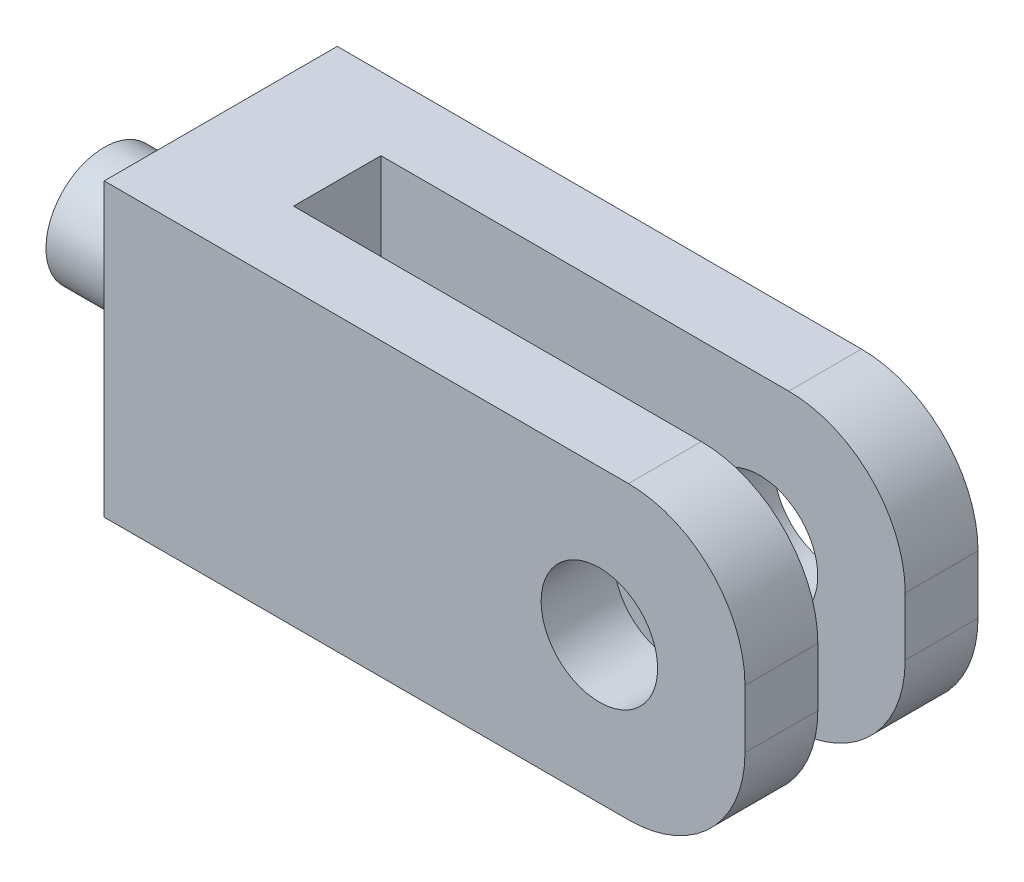
ISO-10303-21;
HEADER;
FILE_DESCRIPTION(('STEP AP214'),'2;1');
FILE_NAME('part.step','',(''),(''),'','','');
FILE_SCHEMA(('AUTOMOTIVE_DESIGN { 1 0 10303 214 1 1 1 1 }'));
ENDSEC;
DATA;
#1=APPLICATION_CONTEXT('core data for automotive mechanical design processes');
#2=APPLICATION_PROTOCOL_DEFINITION('international standard','automotive_design',2000,#1);
#3=PRODUCT_CONTEXT('',#1,'mechanical');
#4=PRODUCT('Part','Part','',(#3));
#5=PRODUCT_RELATED_PRODUCT_CATEGORY('part','',(#4));
#6=PRODUCT_DEFINITION_FORMATION('','',#4);
#7=PRODUCT_DEFINITION_CONTEXT('part definition',#1,'design');
#8=PRODUCT_DEFINITION('design','',#6,#7);
#9=PRODUCT_DEFINITION_SHAPE('','',#8);
#10=(LENGTH_UNIT() NAMED_UNIT(*) SI_UNIT(.MILLI.,.METRE.));
#11=(NAMED_UNIT(*) PLANE_ANGLE_UNIT() SI_UNIT($,.RADIAN.));
#12=(NAMED_UNIT(*) SI_UNIT($,.STERADIAN.) SOLID_ANGLE_UNIT());
#13=UNCERTAINTY_MEASURE_WITH_UNIT(LENGTH_MEASURE(1.E-05),#10,'distance_accuracy_value','');
#14=(GEOMETRIC_REPRESENTATION_CONTEXT(3) GLOBAL_UNCERTAINTY_ASSIGNED_CONTEXT((#13)) GLOBAL_UNIT_ASSIGNED_CONTEXT((#10,
#11,#12)) REPRESENTATION_CONTEXT('',''));
#15=CARTESIAN_POINT('',(0.,0.,0.));
#16=DIRECTION('',(0.,0.,1.));
#17=DIRECTION('',(1.,0.,0.));
#18=AXIS2_PLACEMENT_3D('',#15,#16,#17);
#19=CARTESIAN_POINT('',(55.,25.,40.));
#20=DIRECTION('',(-1.,0.,0.));
#21=DIRECTION('',(0.,0.,1.));
#22=AXIS2_PLACEMENT_3D('',#19,#20,#21);
#23=PLANE('',#22);
#24=DIRECTION('',(0.,1.,0.));
#25=VECTOR('',#24,1.);
#26=CARTESIAN_POINT('',(55.,25.,12.5));
#27=LINE('',#26,#25);
#28=CARTESIAN_POINT('',(55.,-4.99999999999999,12.5));
#29=VERTEX_POINT('',#28);
#30=CARTESIAN_POINT('',(55.,5.00000000000001,12.5));
#31=VERTEX_POINT('',#30);
#32=EDGE_CURVE('E158',#29,#31,#27,.T.);
#33=ORIENTED_EDGE('',*,*,#32,.F.);
#34=DIRECTION('',(0.,0.,-1.));
#35=VECTOR('',#34,1.);
#36=CARTESIAN_POINT('',(55.,-4.99999999999999,40.));
#37=LINE('',#36,#35);
#38=CARTESIAN_POINT('',(55.,-4.99999999999999,0.));
#39=VERTEX_POINT('',#38);
#40=EDGE_CURVE('E214',#29,#39,#37,.T.);
#41=ORIENTED_EDGE('',*,*,#40,.T.);
#42=DIRECTION('',(0.,1.,0.));
#43=VECTOR('',#42,1.);
#44=CARTESIAN_POINT('',(55.,25.,0.));
#45=LINE('',#44,#43);
#46=CARTESIAN_POINT('',(55.,5.00000000000001,0.));
#47=VERTEX_POINT('',#46);
#48=EDGE_CURVE('E165',#39,#47,#45,.T.);
#49=ORIENTED_EDGE('',*,*,#48,.T.);
#50=DIRECTION('',(0.,0.,-1.));
#51=VECTOR('',#50,1.);
#52=CARTESIAN_POINT('',(55.,5.00000000000001,40.));
#53=LINE('',#52,#51);
#54=EDGE_CURVE('E212',#47,#31,#53,.F.);
#55=ORIENTED_EDGE('',*,*,#54,.T.);
#56=EDGE_LOOP('',(#33,#41,#49,#55));
#57=FACE_BOUND('',#56,.T.);
#58=ADVANCED_FACE('F39',(#57),#23,.F.);
#59=DIRECTION('',(0.,1.,0.));
#60=VECTOR('',#59,1.);
#61=CARTESIAN_POINT('',(55.,25.,40.));
#62=LINE('',#61,#60);
#63=CARTESIAN_POINT('',(55.,-4.99999999999999,40.));
#64=VERTEX_POINT('',#63);
#65=CARTESIAN_POINT('',(55.,5.00000000000001,40.));
#66=VERTEX_POINT('',#65);
#67=EDGE_CURVE('E170',#64,#66,#62,.T.);
#68=ORIENTED_EDGE('',*,*,#67,.F.);
#69=DIRECTION('',(0.,0.,-1.));
#70=VECTOR('',#69,1.);
#71=CARTESIAN_POINT('',(55.,-4.99999999999999,40.));
#72=LINE('',#71,#70);
#73=CARTESIAN_POINT('',(55.,-4.99999999999999,27.5));
#74=VERTEX_POINT('',#73);
#75=EDGE_CURVE('E197',#64,#74,#72,.T.);
#76=ORIENTED_EDGE('',*,*,#75,.T.);
#77=DIRECTION('',(0.,-1.,0.));
#78=VECTOR('',#77,1.);
#79=CARTESIAN_POINT('',(55.,25.,27.5));
#80=LINE('',#79,#78);
#81=CARTESIAN_POINT('',(55.,5.00000000000001,27.5));
#82=VERTEX_POINT('',#81);
#83=EDGE_CURVE('E147',#82,#74,#80,.T.);
#84=ORIENTED_EDGE('',*,*,#83,.F.);
#85=DIRECTION('',(0.,0.,-1.));
#86=VECTOR('',#85,1.);
#87=CARTESIAN_POINT('',(55.,5.00000000000001,40.));
#88=LINE('',#87,#86);
#89=EDGE_CURVE('E195',#82,#66,#88,.F.);
#90=ORIENTED_EDGE('',*,*,#89,.T.);
#91=EDGE_LOOP('',(#68,#76,#84,#90));
#92=FACE_BOUND('',#91,.T.);
#93=ADVANCED_FACE('F249',(#92),#23,.F.);
#94=CARTESIAN_POINT('',(-55.,25.,40.));
#95=DIRECTION('',(0.,-1.,0.));
#96=DIRECTION('',(0.,0.,-1.));
#97=AXIS2_PLACEMENT_3D('',#94,#95,#96);
#98=PLANE('',#97);
#99=DIRECTION('',(1.,0.,0.));
#100=VECTOR('',#99,1.);
#101=CARTESIAN_POINT('',(-35.,25.,12.5));
#102=LINE('',#101,#100);
#103=CARTESIAN_POINT('',(-35.,25.,12.5));
#104=VERTEX_POINT('',#103);
#105=CARTESIAN_POINT('',(35.,25.,12.5));
#106=VERTEX_POINT('',#105);
#107=EDGE_CURVE('E129',#104,#106,#102,.T.);
#108=ORIENTED_EDGE('',*,*,#107,.T.);
#109=DIRECTION('',(0.,0.,-1.));
#110=VECTOR('',#109,1.);
#111=CARTESIAN_POINT('',(35.,25.,40.));
#112=LINE('',#111,#110);
#113=CARTESIAN_POINT('',(35.,25.,0.));
#114=VERTEX_POINT('',#113);
#115=EDGE_CURVE('E48',#106,#114,#112,.T.);
#116=ORIENTED_EDGE('',*,*,#115,.T.);
#117=DIRECTION('',(-1.,0.,0.));
#118=VECTOR('',#117,1.);
#119=CARTESIAN_POINT('',(-55.,25.,0.));
#120=LINE('',#119,#118);
#121=CARTESIAN_POINT('',(-55.,25.,0.));
#122=VERTEX_POINT('',#121);
#123=EDGE_CURVE('E184',#114,#122,#120,.T.);
#124=ORIENTED_EDGE('',*,*,#123,.T.);
#125=DIRECTION('',(0.,0.,-1.));
#126=VECTOR('',#125,1.);
#127=CARTESIAN_POINT('',(-55.,25.,40.));
#128=LINE('',#127,#126);
#129=CARTESIAN_POINT('',(-55.,25.,40.));
#130=VERTEX_POINT('',#129);
#131=EDGE_CURVE('E192',#130,#122,#128,.T.);
#132=ORIENTED_EDGE('',*,*,#131,.F.);
#133=DIRECTION('',(-1.,0.,0.));
#134=VECTOR('',#133,1.);
#135=CARTESIAN_POINT('',(-55.,25.,40.));
#136=LINE('',#135,#134);
#137=CARTESIAN_POINT('',(35.,25.,40.));
#138=VERTEX_POINT('',#137);
#139=EDGE_CURVE('E173',#138,#130,#136,.T.);
#140=ORIENTED_EDGE('',*,*,#139,.F.);
#141=DIRECTION('',(0.,0.,-1.));
#142=VECTOR('',#141,1.);
#143=CARTESIAN_POINT('',(35.,25.,40.));
#144=LINE('',#143,#142);
#145=CARTESIAN_POINT('',(35.,25.,27.5));
#146=VERTEX_POINT('',#145);
#147=EDGE_CURVE('E223',#138,#146,#144,.T.);
#148=ORIENTED_EDGE('',*,*,#147,.T.);
#149=DIRECTION('',(1.,0.,0.));
#150=VECTOR('',#149,1.);
#151=CARTESIAN_POINT('',(-35.,25.,27.5));
#152=LINE('',#151,#150);
#153=CARTESIAN_POINT('',(-35.,25.,27.5));
#154=VERTEX_POINT('',#153);
#155=EDGE_CURVE('E137',#154,#146,#152,.T.);
#156=ORIENTED_EDGE('',*,*,#155,.F.);
#157=DIRECTION('',(0.,0.,1.));
#158=VECTOR('',#157,1.);
#159=CARTESIAN_POINT('',(-35.,25.,27.5));
#160=LINE('',#159,#158);
#161=EDGE_CURVE('E143',#104,#154,#160,.T.);
#162=ORIENTED_EDGE('',*,*,#161,.F.);
#163=EDGE_LOOP('',(#108,#116,#124,#132,#140,#148,#156,#162));
#164=FACE_BOUND('',#163,.T.);
#165=ADVANCED_FACE('F149',(#164),#98,.F.);
#166=CARTESIAN_POINT('',(-55.,25.,40.));
#167=DIRECTION('',(1.,0.,0.));
#168=DIRECTION('',(0.,1.,0.));
#169=AXIS2_PLACEMENT_3D('',#166,#167,#168);
#170=PLANE('',#169);
#171=CARTESIAN_POINT('',(-55.,0.,20.));
#172=DIRECTION('',(-1.,0.,0.));
#173=DIRECTION('',(0.,-1.,0.));
#174=AXIS2_PLACEMENT_3D('',#171,#172,#173);
#175=CIRCLE('',#174,10.);
#176=CARTESIAN_POINT('',(-55.,-10.,20.));
#177=VERTEX_POINT('',#176);
#178=EDGE_CURVE('E11',#177,#177,#175,.T.);
#179=ORIENTED_EDGE('',*,*,#178,.F.);
#180=EDGE_LOOP('',(#179));
#181=FACE_BOUND('',#180,.T.);
#182=DIRECTION('',(0.,-1.,0.));
#183=VECTOR('',#182,1.);
#184=CARTESIAN_POINT('',(-55.,25.,0.));
#185=LINE('',#184,#183);
#186=CARTESIAN_POINT('',(-55.,-25.,0.));
#187=VERTEX_POINT('',#186);
#188=EDGE_CURVE('E186',#122,#187,#185,.T.);
#189=ORIENTED_EDGE('',*,*,#188,.T.);
#190=DIRECTION('',(0.,0.,-1.));
#191=VECTOR('',#190,1.);
#192=CARTESIAN_POINT('',(-55.,-25.,40.));
#193=LINE('',#192,#191);
#194=CARTESIAN_POINT('',(-55.,-25.,40.));
#195=VERTEX_POINT('',#194);
#196=EDGE_CURVE('E181',#195,#187,#193,.T.);
#197=ORIENTED_EDGE('',*,*,#196,.F.);
#198=DIRECTION('',(0.,-1.,0.));
#199=VECTOR('',#198,1.);
#200=CARTESIAN_POINT('',(-55.,25.,40.));
#201=LINE('',#200,#199);
#202=EDGE_CURVE('E176',#130,#195,#201,.T.);
#203=ORIENTED_EDGE('',*,*,#202,.F.);
#204=ORIENTED_EDGE('',*,*,#131,.T.);
#205=EDGE_LOOP('',(#189,#197,#203,#204));
#206=FACE_BOUND('',#205,.T.);
#207=ADVANCED_FACE('F233',(#181,#206),#170,.F.);
#208=CARTESIAN_POINT('',(-55.,-25.,40.));
#209=DIRECTION('',(0.,1.,0.));
#210=DIRECTION('',(0.,0.,1.));
#211=AXIS2_PLACEMENT_3D('',#208,#209,#210);
#212=PLANE('',#211);
#213=DIRECTION('',(1.,0.,0.));
#214=VECTOR('',#213,1.);
#215=CARTESIAN_POINT('',(-35.,-25.,27.5));
#216=LINE('',#215,#214);
#217=CARTESIAN_POINT('',(-35.,-25.,27.5));
#218=VERTEX_POINT('',#217);
#219=CARTESIAN_POINT('',(35.,-25.,27.5));
#220=VERTEX_POINT('',#219);
#221=EDGE_CURVE('E166',#218,#220,#216,.T.);
#222=ORIENTED_EDGE('',*,*,#221,.T.);
#223=DIRECTION('',(0.,0.,-1.));
#224=VECTOR('',#223,1.);
#225=CARTESIAN_POINT('',(35.,-25.,40.));
#226=LINE('',#225,#224);
#227=CARTESIAN_POINT('',(35.,-25.,40.));
#228=VERTEX_POINT('',#227);
#229=EDGE_CURVE('E206',#220,#228,#226,.F.);
#230=ORIENTED_EDGE('',*,*,#229,.T.);
#231=DIRECTION('',(1.,0.,0.));
#232=VECTOR('',#231,1.);
#233=CARTESIAN_POINT('',(-55.,-25.,40.));
#234=LINE('',#233,#232);
#235=EDGE_CURVE('E178',#195,#228,#234,.T.);
#236=ORIENTED_EDGE('',*,*,#235,.F.);
#237=ORIENTED_EDGE('',*,*,#196,.T.);
#238=DIRECTION('',(1.,0.,0.));
#239=VECTOR('',#238,1.);
#240=CARTESIAN_POINT('',(-55.,-25.,0.));
#241=LINE('',#240,#239);
#242=CARTESIAN_POINT('',(35.,-25.,0.));
#243=VERTEX_POINT('',#242);
#244=EDGE_CURVE('E174',#187,#243,#241,.T.);
#245=ORIENTED_EDGE('',*,*,#244,.T.);
#246=DIRECTION('',(0.,0.,-1.));
#247=VECTOR('',#246,1.);
#248=CARTESIAN_POINT('',(35.,-25.,40.));
#249=LINE('',#248,#247);
#250=CARTESIAN_POINT('',(35.,-25.,12.5));
#251=VERTEX_POINT('',#250);
#252=EDGE_CURVE('E204',#243,#251,#249,.F.);
#253=ORIENTED_EDGE('',*,*,#252,.T.);
#254=DIRECTION('',(1.,0.,0.));
#255=VECTOR('',#254,1.);
#256=CARTESIAN_POINT('',(-35.,-25.,12.5));
#257=LINE('',#256,#255);
#258=CARTESIAN_POINT('',(-35.,-25.,12.5));
#259=VERTEX_POINT('',#258);
#260=EDGE_CURVE('E163',#259,#251,#257,.T.);
#261=ORIENTED_EDGE('',*,*,#260,.F.);
#262=DIRECTION('',(0.,0.,-1.));
#263=VECTOR('',#262,1.);
#264=CARTESIAN_POINT('',(-35.,-25.,27.5));
#265=LINE('',#264,#263);
#266=EDGE_CURVE('E138',#218,#259,#265,.T.);
#267=ORIENTED_EDGE('',*,*,#266,.F.);
#268=EDGE_LOOP('',(#222,#230,#236,#237,#245,#253,#261,#267));
#269=FACE_BOUND('',#268,.T.);
#270=ADVANCED_FACE('F237',(#269),#212,.F.);
#271=CARTESIAN_POINT('',(0.,0.,40.));
#272=DIRECTION('',(0.,0.,1.));
#273=DIRECTION('',(1.,0.,0.));
#274=AXIS2_PLACEMENT_3D('',#271,#272,#273);
#275=PLANE('',#274);
#276=CARTESIAN_POINT('',(30.,0.,40.));
#277=DIRECTION('',(0.,0.,1.));
#278=DIRECTION('',(1.,0.,0.));
#279=AXIS2_PLACEMENT_3D('',#276,#277,#278);
#280=CIRCLE('',#279,10.);
#281=CARTESIAN_POINT('',(20.,0.,40.));
#282=VERTEX_POINT('',#281);
#283=EDGE_CURVE('E160',#282,#282,#280,.T.);
#284=ORIENTED_EDGE('',*,*,#283,.F.);
#285=EDGE_LOOP('',(#284));
#286=FACE_BOUND('',#285,.T.);
#287=ORIENTED_EDGE('',*,*,#235,.T.);
#288=CARTESIAN_POINT('',(35.,-4.99999999999999,40.));
#289=DIRECTION('',(0.,0.,1.));
#290=DIRECTION('',(1.,0.,0.));
#291=AXIS2_PLACEMENT_3D('',#288,#289,#290);
#292=CIRCLE('',#291,20.);
#293=EDGE_CURVE('E210',#228,#64,#292,.T.);
#294=ORIENTED_EDGE('',*,*,#293,.T.);
#295=ORIENTED_EDGE('',*,*,#67,.T.);
#296=CARTESIAN_POINT('',(35.,5.00000000000001,40.));
#297=DIRECTION('',(0.,0.,1.));
#298=DIRECTION('',(1.,0.,0.));
#299=AXIS2_PLACEMENT_3D('',#296,#297,#298);
#300=CIRCLE('',#299,20.);
#301=EDGE_CURVE('E208',#66,#138,#300,.T.);
#302=ORIENTED_EDGE('',*,*,#301,.T.);
#303=ORIENTED_EDGE('',*,*,#139,.T.);
#304=ORIENTED_EDGE('',*,*,#202,.T.);
#305=EDGE_LOOP('',(#287,#294,#295,#302,#303,#304));
#306=FACE_BOUND('',#305,.T.);
#307=ADVANCED_FACE('F242',(#286,#306),#275,.T.);
#308=CARTESIAN_POINT('',(0.,0.,0.));
#309=DIRECTION('',(0.,0.,1.));
#310=DIRECTION('',(1.,0.,0.));
#311=AXIS2_PLACEMENT_3D('',#308,#309,#310);
#312=PLANE('',#311);
#313=CARTESIAN_POINT('',(30.,0.,0.));
#314=DIRECTION('',(0.,0.,-1.));
#315=DIRECTION('',(-1.,0.,0.));
#316=AXIS2_PLACEMENT_3D('',#313,#314,#315);
#317=CIRCLE('',#316,10.);
#318=CARTESIAN_POINT('',(20.,0.,0.));
#319=VERTEX_POINT('',#318);
#320=EDGE_CURVE('E421',#319,#319,#317,.T.);
#321=ORIENTED_EDGE('',*,*,#320,.F.);
#322=EDGE_LOOP('',(#321));
#323=FACE_BOUND('',#322,.T.);
#324=ORIENTED_EDGE('',*,*,#48,.F.);
#325=CARTESIAN_POINT('',(35.,-4.99999999999999,0.));
#326=DIRECTION('',(0.,0.,1.));
#327=DIRECTION('',(1.,0.,0.));
#328=AXIS2_PLACEMENT_3D('',#325,#326,#327);
#329=CIRCLE('',#328,20.);
#330=EDGE_CURVE('E218',#39,#243,#329,.F.);
#331=ORIENTED_EDGE('',*,*,#330,.T.);
#332=ORIENTED_EDGE('',*,*,#244,.F.);
#333=ORIENTED_EDGE('',*,*,#188,.F.);
#334=ORIENTED_EDGE('',*,*,#123,.F.);
#335=CARTESIAN_POINT('',(35.,5.00000000000001,0.));
#336=DIRECTION('',(0.,0.,1.));
#337=DIRECTION('',(1.,0.,0.));
#338=AXIS2_PLACEMENT_3D('',#335,#336,#337);
#339=CIRCLE('',#338,20.);
#340=EDGE_CURVE('E64',#114,#47,#339,.F.);
#341=ORIENTED_EDGE('',*,*,#340,.T.);
#342=EDGE_LOOP('',(#324,#331,#332,#333,#334,#341));
#343=FACE_BOUND('',#342,.T.);
#344=ADVANCED_FACE('F229',(#323,#343),#312,.F.);
#345=CARTESIAN_POINT('',(-35.,25.,12.5));
#346=DIRECTION('',(0.,0.,-1.));
#347=DIRECTION('',(0.,1.,0.));
#348=AXIS2_PLACEMENT_3D('',#345,#346,#347);
#349=PLANE('',#348);
#350=CARTESIAN_POINT('',(30.,0.,12.5));
#351=DIRECTION('',(0.,0.,-1.));
#352=DIRECTION('',(0.,1.,0.));
#353=AXIS2_PLACEMENT_3D('',#350,#351,#352);
#354=CIRCLE('',#353,10.);
#355=CARTESIAN_POINT('',(20.,0.,12.5));
#356=VERTEX_POINT('',#355);
#357=EDGE_CURVE('E426',#356,#356,#354,.T.);
#358=ORIENTED_EDGE('',*,*,#357,.T.);
#359=EDGE_LOOP('',(#358));
#360=FACE_BOUND('',#359,.T.);
#361=ORIENTED_EDGE('',*,*,#260,.T.);
#362=CARTESIAN_POINT('',(35.,-4.99999999999999,12.5));
#363=DIRECTION('',(0.,0.,-1.));
#364=DIRECTION('',(0.,1.,0.));
#365=AXIS2_PLACEMENT_3D('',#362,#363,#364);
#366=CIRCLE('',#365,20.);
#367=EDGE_CURVE('E221',#251,#29,#366,.F.);
#368=ORIENTED_EDGE('',*,*,#367,.T.);
#369=ORIENTED_EDGE('',*,*,#32,.T.);
#370=CARTESIAN_POINT('',(35.,5.00000000000001,12.5));
#371=DIRECTION('',(0.,0.,-1.));
#372=DIRECTION('',(0.,1.,0.));
#373=AXIS2_PLACEMENT_3D('',#370,#371,#372);
#374=CIRCLE('',#373,20.);
#375=EDGE_CURVE('E56',#31,#106,#374,.F.);
#376=ORIENTED_EDGE('',*,*,#375,.T.);
#377=ORIENTED_EDGE('',*,*,#107,.F.);
#378=DIRECTION('',(0.,1.,0.));
#379=VECTOR('',#378,1.);
#380=CARTESIAN_POINT('',(-35.,25.,12.5));
#381=LINE('',#380,#379);
#382=EDGE_CURVE('E133',#259,#104,#381,.T.);
#383=ORIENTED_EDGE('',*,*,#382,.F.);
#384=EDGE_LOOP('',(#361,#368,#369,#376,#377,#383));
#385=FACE_BOUND('',#384,.T.);
#386=ADVANCED_FACE('F132',(#360,#385),#349,.F.);
#387=CARTESIAN_POINT('',(-35.,25.,27.5));
#388=DIRECTION('',(0.,0.,1.));
#389=DIRECTION('',(0.,-1.,0.));
#390=AXIS2_PLACEMENT_3D('',#387,#388,#389);
#391=PLANE('',#390);
#392=CARTESIAN_POINT('',(30.,0.,27.5));
#393=DIRECTION('',(0.,0.,1.));
#394=DIRECTION('',(0.,-1.,0.));
#395=AXIS2_PLACEMENT_3D('',#392,#393,#394);
#396=CIRCLE('',#395,10.);
#397=CARTESIAN_POINT('',(20.,0.,27.5));
#398=VERTEX_POINT('',#397);
#399=EDGE_CURVE('E43',#398,#398,#396,.T.);
#400=ORIENTED_EDGE('',*,*,#399,.T.);
#401=EDGE_LOOP('',(#400));
#402=FACE_BOUND('',#401,.T.);
#403=ORIENTED_EDGE('',*,*,#83,.T.);
#404=CARTESIAN_POINT('',(35.,-4.99999999999999,27.5));
#405=DIRECTION('',(0.,0.,1.));
#406=DIRECTION('',(0.,-1.,0.));
#407=AXIS2_PLACEMENT_3D('',#404,#405,#406);
#408=CIRCLE('',#407,20.);
#409=EDGE_CURVE('E202',#74,#220,#408,.F.);
#410=ORIENTED_EDGE('',*,*,#409,.T.);
#411=ORIENTED_EDGE('',*,*,#221,.F.);
#412=DIRECTION('',(0.,-1.,0.));
#413=VECTOR('',#412,1.);
#414=CARTESIAN_POINT('',(-35.,25.,27.5));
#415=LINE('',#414,#413);
#416=EDGE_CURVE('E152',#154,#218,#415,.T.);
#417=ORIENTED_EDGE('',*,*,#416,.F.);
#418=ORIENTED_EDGE('',*,*,#155,.T.);
#419=CARTESIAN_POINT('',(35.,5.00000000000001,27.5));
#420=DIRECTION('',(0.,0.,1.));
#421=DIRECTION('',(0.,-1.,0.));
#422=AXIS2_PLACEMENT_3D('',#419,#420,#421);
#423=CIRCLE('',#422,20.);
#424=EDGE_CURVE('E200',#146,#82,#423,.F.);
#425=ORIENTED_EDGE('',*,*,#424,.T.);
#426=EDGE_LOOP('',(#403,#410,#411,#417,#418,#425));
#427=FACE_BOUND('',#426,.T.);
#428=ADVANCED_FACE('F252',(#402,#427),#391,.F.);
#429=CARTESIAN_POINT('',(-35.,0.,0.));
#430=DIRECTION('',(1.,0.,0.));
#431=DIRECTION('',(0.,0.,-1.));
#432=AXIS2_PLACEMENT_3D('',#429,#430,#431);
#433=PLANE('',#432);
#434=ORIENTED_EDGE('',*,*,#382,.T.);
#435=ORIENTED_EDGE('',*,*,#161,.T.);
#436=ORIENTED_EDGE('',*,*,#416,.T.);
#437=ORIENTED_EDGE('',*,*,#266,.T.);
#438=EDGE_LOOP('',(#434,#435,#436,#437));
#439=FACE_BOUND('',#438,.T.);
#440=ADVANCED_FACE('F142',(#439),#433,.T.);
#441=CARTESIAN_POINT('',(35.,-4.99999999999999,40.));
#442=DIRECTION('',(0.,0.,-1.));
#443=DIRECTION('',(-1.,0.,0.));
#444=AXIS2_PLACEMENT_3D('',#441,#442,#443);
#445=CYLINDRICAL_SURFACE('',#444,20.);
#446=ORIENTED_EDGE('',*,*,#293,.F.);
#447=ORIENTED_EDGE('',*,*,#229,.F.);
#448=ORIENTED_EDGE('',*,*,#409,.F.);
#449=ORIENTED_EDGE('',*,*,#75,.F.);
#450=EDGE_LOOP('',(#446,#447,#448,#449));
#451=FACE_BOUND('',#450,.T.);
#452=ADVANCED_FACE('F246',(#451),#445,.T.);
#453=CARTESIAN_POINT('',(35.,-4.99999999999999,40.));
#454=DIRECTION('',(0.,0.,-1.));
#455=DIRECTION('',(-1.,0.,0.));
#456=AXIS2_PLACEMENT_3D('',#453,#454,#455);
#457=CYLINDRICAL_SURFACE('',#456,20.);
#458=ORIENTED_EDGE('',*,*,#367,.F.);
#459=ORIENTED_EDGE('',*,*,#252,.F.);
#460=ORIENTED_EDGE('',*,*,#330,.F.);
#461=ORIENTED_EDGE('',*,*,#40,.F.);
#462=EDGE_LOOP('',(#458,#459,#460,#461));
#463=FACE_BOUND('',#462,.T.);
#464=ADVANCED_FACE('F268',(#463),#457,.T.);
#465=CARTESIAN_POINT('',(35.,5.00000000000001,40.));
#466=DIRECTION('',(0.,0.,-1.));
#467=DIRECTION('',(-1.,0.,0.));
#468=AXIS2_PLACEMENT_3D('',#465,#466,#467);
#469=CYLINDRICAL_SURFACE('',#468,20.);
#470=ORIENTED_EDGE('',*,*,#375,.F.);
#471=ORIENTED_EDGE('',*,*,#54,.F.);
#472=ORIENTED_EDGE('',*,*,#340,.F.);
#473=ORIENTED_EDGE('',*,*,#115,.F.);
#474=EDGE_LOOP('',(#470,#471,#472,#473));
#475=FACE_BOUND('',#474,.T.);
#476=ADVANCED_FACE('F260',(#475),#469,.T.);
#477=CARTESIAN_POINT('',(35.,5.00000000000001,40.));
#478=DIRECTION('',(0.,0.,-1.));
#479=DIRECTION('',(-1.,0.,0.));
#480=AXIS2_PLACEMENT_3D('',#477,#478,#479);
#481=CYLINDRICAL_SURFACE('',#480,20.);
#482=ORIENTED_EDGE('',*,*,#301,.F.);
#483=ORIENTED_EDGE('',*,*,#89,.F.);
#484=ORIENTED_EDGE('',*,*,#424,.F.);
#485=ORIENTED_EDGE('',*,*,#147,.F.);
#486=EDGE_LOOP('',(#482,#483,#484,#485));
#487=FACE_BOUND('',#486,.T.);
#488=ADVANCED_FACE('F41',(#487),#481,.T.);
#489=CARTESIAN_POINT('',(30.,0.,90.));
#490=DIRECTION('',(0.,0.,-1.));
#491=DIRECTION('',(-1.,0.,0.));
#492=AXIS2_PLACEMENT_3D('',#489,#490,#491);
#493=CYLINDRICAL_SURFACE('',#492,10.);
#494=CARTESIAN_POINT('',(20.,0.,40.));
#495=CARTESIAN_POINT('',(20.,0.,39.8697916666667));
#496=CARTESIAN_POINT('',(20.,0.,39.7395833333333));
#497=CARTESIAN_POINT('',(20.,0.,39.4791666666667));
#498=CARTESIAN_POINT('',(20.,0.,39.3489583333333));
#499=CARTESIAN_POINT('',(20.,0.,39.0885416666667));
#500=CARTESIAN_POINT('',(20.,0.,38.9583333333333));
#501=CARTESIAN_POINT('',(20.,0.,38.6979166666667));
#502=CARTESIAN_POINT('',(20.,0.,38.5677083333333));
#503=CARTESIAN_POINT('',(20.,0.,38.3072916666667));
#504=CARTESIAN_POINT('',(20.,0.,38.1770833333333));
#505=CARTESIAN_POINT('',(20.,0.,37.9166666666667));
#506=CARTESIAN_POINT('',(20.,0.,37.7864583333333));
#507=CARTESIAN_POINT('',(20.,0.,37.5260416666667));
#508=CARTESIAN_POINT('',(20.,0.,37.3958333333333));
#509=CARTESIAN_POINT('',(20.,0.,37.1354166666667));
#510=CARTESIAN_POINT('',(20.,0.,37.0052083333333));
#511=CARTESIAN_POINT('',(20.,0.,36.7447916666667));
#512=CARTESIAN_POINT('',(20.,0.,36.6145833333333));
#513=CARTESIAN_POINT('',(20.,0.,36.3541666666667));
#514=CARTESIAN_POINT('',(20.,0.,36.2239583333333));
#515=CARTESIAN_POINT('',(20.,0.,35.9635416666667));
#516=CARTESIAN_POINT('',(20.,0.,35.8333333333333));
#517=CARTESIAN_POINT('',(20.,0.,35.5729166666667));
#518=CARTESIAN_POINT('',(20.,0.,35.4427083333333));
#519=CARTESIAN_POINT('',(20.,0.,35.1822916666667));
#520=CARTESIAN_POINT('',(20.,0.,35.0520833333333));
#521=CARTESIAN_POINT('',(20.,0.,34.7916666666667));
#522=CARTESIAN_POINT('',(20.,0.,34.6614583333333));
#523=CARTESIAN_POINT('',(20.,0.,34.4010416666667));
#524=CARTESIAN_POINT('',(20.,0.,34.2708333333333));
#525=CARTESIAN_POINT('',(20.,0.,34.0104166666667));
#526=CARTESIAN_POINT('',(20.,0.,33.8802083333333));
#527=CARTESIAN_POINT('',(20.,0.,33.6197916666667));
#528=CARTESIAN_POINT('',(20.,0.,33.4895833333333));
#529=CARTESIAN_POINT('',(20.,0.,33.2291666666667));
#530=CARTESIAN_POINT('',(20.,0.,33.0989583333333));
#531=CARTESIAN_POINT('',(20.,0.,32.8385416666667));
#532=CARTESIAN_POINT('',(20.,0.,32.7083333333333));
#533=CARTESIAN_POINT('',(20.,0.,32.4479166666667));
#534=CARTESIAN_POINT('',(20.,0.,32.3177083333333));
#535=CARTESIAN_POINT('',(20.,0.,32.0572916666667));
#536=CARTESIAN_POINT('',(20.,0.,31.9270833333333));
#537=CARTESIAN_POINT('',(20.,0.,31.6666666666667));
#538=CARTESIAN_POINT('',(20.,0.,31.5364583333333));
#539=CARTESIAN_POINT('',(20.,0.,31.2760416666667));
#540=CARTESIAN_POINT('',(20.,0.,31.1458333333333));
#541=CARTESIAN_POINT('',(20.,0.,30.8854166666667));
#542=CARTESIAN_POINT('',(20.,0.,30.7552083333333));
#543=CARTESIAN_POINT('',(20.,0.,30.4947916666667));
#544=CARTESIAN_POINT('',(20.,0.,30.3645833333333));
#545=CARTESIAN_POINT('',(20.,0.,30.1041666666667));
#546=CARTESIAN_POINT('',(20.,0.,29.9739583333333));
#547=CARTESIAN_POINT('',(20.,0.,29.7135416666667));
#548=CARTESIAN_POINT('',(20.,0.,29.5833333333333));
#549=CARTESIAN_POINT('',(20.,0.,29.3229166666667));
#550=CARTESIAN_POINT('',(20.,0.,29.1927083333333));
#551=CARTESIAN_POINT('',(20.,0.,28.9322916666667));
#552=CARTESIAN_POINT('',(20.,0.,28.8020833333333));
#553=CARTESIAN_POINT('',(20.,0.,28.5416666666667));
#554=CARTESIAN_POINT('',(20.,0.,28.4114583333333));
#555=CARTESIAN_POINT('',(20.,0.,28.1510416666667));
#556=CARTESIAN_POINT('',(20.,0.,28.0208333333333));
#557=CARTESIAN_POINT('',(20.,0.,27.7604166666667));
#558=CARTESIAN_POINT('',(20.,0.,27.6302083333333));
#559=CARTESIAN_POINT('',(20.,0.,27.5));
#560=B_SPLINE_CURVE_WITH_KNOTS('',3,(#494,#495,#496,#497,#498,#499,#500,#501,#502,#503,#504,
#505,#506,#507,#508,#509,#510,#511,#512,#513,#514,#515,#516,#517,#518,#519,#520,#521,#522,#523,
#524,#525,#526,#527,#528,#529,#530,#531,#532,#533,#534,#535,#536,#537,#538,#539,#540,#541,#542,
#543,#544,#545,#546,#547,#548,#549,#550,#551,#552,#553,#554,#555,#556,#557,#558,#559),
.UNSPECIFIED.,.F.,.F.,(4,2,2,2,2,2,2,2,2,2,2,2,2,2,2,2,2,2,2,2,2,2,2,2,2,2,2,2,2,2,2,2,4),(0.,
0.390624999999999,0.781249999999997,1.171875,1.5625,1.953125,2.34375,2.734375,3.125,3.515625,
3.90625,4.296875,4.6875,5.078125,5.46875,5.859375,6.25,6.640625,7.03125,7.42187499999999,7.8125,
8.203125,8.59375,8.984375,9.37499999999999,9.765625,10.15625,10.546875,10.9375,11.328125,
11.71875,12.109375,12.5),.UNSPECIFIED.);
#561=EDGE_CURVE('BSEAM259',#282,#398,#560,.T.);
#562=ORIENTED_EDGE('',*,*,#283,.T.);
#563=ORIENTED_EDGE('',*,*,#399,.F.);
#564=ORIENTED_EDGE('',*,*,#561,.T.);
#565=ORIENTED_EDGE('',*,*,#561,.F.);
#566=EDGE_LOOP('',(#562,#564,#563,#565));
#567=FACE_BOUND('',#566,.T.);
#568=ADVANCED_FACE('F259',(#567),#493,.F.);
#569=CARTESIAN_POINT('',(20.,0.,0.));
#570=CARTESIAN_POINT('',(20.,0.,0.130208333333349));
#571=CARTESIAN_POINT('',(20.,0.,0.260416666666684));
#572=CARTESIAN_POINT('',(20.,0.,0.52083333333335));
#573=CARTESIAN_POINT('',(20.,0.,0.651041666666681));
#574=CARTESIAN_POINT('',(20.,0.,0.911458333333346));
#575=CARTESIAN_POINT('',(20.,0.,1.04166666666668));
#576=CARTESIAN_POINT('',(20.,0.,1.30208333333335));
#577=CARTESIAN_POINT('',(20.,0.,1.43229166666668));
#578=CARTESIAN_POINT('',(20.,0.,1.69270833333334));
#579=CARTESIAN_POINT('',(20.,0.,1.82291666666668));
#580=CARTESIAN_POINT('',(20.,0.,2.08333333333335));
#581=CARTESIAN_POINT('',(20.,0.,2.21354166666668));
#582=CARTESIAN_POINT('',(20.,0.,2.47395833333335));
#583=CARTESIAN_POINT('',(20.,0.,2.60416666666668));
#584=CARTESIAN_POINT('',(20.,0.,2.86458333333335));
#585=CARTESIAN_POINT('',(20.,0.,2.99479166666668));
#586=CARTESIAN_POINT('',(20.,0.,3.25520833333335));
#587=CARTESIAN_POINT('',(20.,0.,3.38541666666669));
#588=CARTESIAN_POINT('',(20.,0.,3.64583333333335));
#589=CARTESIAN_POINT('',(20.,0.,3.77604166666668));
#590=CARTESIAN_POINT('',(20.,0.,4.03645833333335));
#591=CARTESIAN_POINT('',(20.,0.,4.16666666666668));
#592=CARTESIAN_POINT('',(20.,0.,4.42708333333336));
#593=CARTESIAN_POINT('',(20.,0.,4.55729166666669));
#594=CARTESIAN_POINT('',(20.,0.,4.81770833333336));
#595=CARTESIAN_POINT('',(20.,0.,4.94791666666669));
#596=CARTESIAN_POINT('',(20.,0.,5.20833333333335));
#597=CARTESIAN_POINT('',(20.,0.,5.33854166666669));
#598=CARTESIAN_POINT('',(20.,0.,5.59895833333335));
#599=CARTESIAN_POINT('',(20.,0.,5.72916666666668));
#600=CARTESIAN_POINT('',(20.,0.,5.98958333333335));
#601=CARTESIAN_POINT('',(20.,0.,6.11979166666668));
#602=CARTESIAN_POINT('',(20.,0.,6.38020833333336));
#603=CARTESIAN_POINT('',(20.,0.,6.51041666666669));
#604=CARTESIAN_POINT('',(20.,0.,6.77083333333336));
#605=CARTESIAN_POINT('',(20.,0.,6.90104166666669));
#606=CARTESIAN_POINT('',(20.,0.,7.16145833333335));
#607=CARTESIAN_POINT('',(20.,0.,7.29166666666669));
#608=CARTESIAN_POINT('',(20.,0.,7.55208333333335));
#609=CARTESIAN_POINT('',(20.,0.,7.68229166666668));
#610=CARTESIAN_POINT('',(20.,0.,7.94270833333335));
#611=CARTESIAN_POINT('',(20.,0.,8.07291666666669));
#612=CARTESIAN_POINT('',(20.,0.,8.33333333333335));
#613=CARTESIAN_POINT('',(20.,0.,8.46354166666669));
#614=CARTESIAN_POINT('',(20.,0.,8.72395833333336));
#615=CARTESIAN_POINT('',(20.,0.,8.85416666666669));
#616=CARTESIAN_POINT('',(20.,0.,9.11458333333335));
#617=CARTESIAN_POINT('',(20.,0.,9.24479166666669));
#618=CARTESIAN_POINT('',(20.,0.,9.50520833333336));
#619=CARTESIAN_POINT('',(20.,0.,9.63541666666669));
#620=CARTESIAN_POINT('',(20.,0.,9.89583333333336));
#621=CARTESIAN_POINT('',(20.,0.,10.0260416666667));
#622=CARTESIAN_POINT('',(20.,0.,10.2864583333334));
#623=CARTESIAN_POINT('',(20.,0.,10.4166666666667));
#624=CARTESIAN_POINT('',(20.,0.,10.6770833333334));
#625=CARTESIAN_POINT('',(20.,0.,10.8072916666667));
#626=CARTESIAN_POINT('',(20.,0.,11.0677083333334));
#627=CARTESIAN_POINT('',(20.,0.,11.1979166666667));
#628=CARTESIAN_POINT('',(20.,0.,11.4583333333334));
#629=CARTESIAN_POINT('',(20.,0.,11.5885416666667));
#630=CARTESIAN_POINT('',(20.,0.,11.8489583333334));
#631=CARTESIAN_POINT('',(20.,0.,11.9791666666667));
#632=CARTESIAN_POINT('',(20.,0.,12.2395833333334));
#633=CARTESIAN_POINT('',(20.,0.,12.3697916666667));
#634=CARTESIAN_POINT('',(20.,0.,12.5));
#635=B_SPLINE_CURVE_WITH_KNOTS('',3,(#569,#570,#571,#572,#573,#574,#575,#576,#577,#578,#579,
#580,#581,#582,#583,#584,#585,#586,#587,#588,#589,#590,#591,#592,#593,#594,#595,#596,#597,#598,
#599,#600,#601,#602,#603,#604,#605,#606,#607,#608,#609,#610,#611,#612,#613,#614,#615,#616,#617,
#618,#619,#620,#621,#622,#623,#624,#625,#626,#627,#628,#629,#630,#631,#632,#633,#634),
.UNSPECIFIED.,.F.,.F.,(4,2,2,2,2,2,2,2,2,2,2,2,2,2,2,2,2,2,2,2,2,2,2,2,2,2,2,2,2,2,2,2,4),(0.,
0.390625000000006,0.781249999999997,1.171875,1.56249999999999,1.953125,2.34375000000001,
2.734375,3.125,3.51562500000001,3.90625,4.29687500000001,4.68750000000001,5.078125,
5.46875000000001,5.859375,6.25000000000001,6.64062500000001,7.03125,7.42187500000001,7.8125,
8.20312500000001,8.59375000000001,8.984375,9.37500000000001,9.76562500000001,10.15625,10.546875,
10.9375,11.328125,11.71875,12.109375,12.5),.UNSPECIFIED.);
#636=EDGE_CURVE('BSEAM265',#319,#356,#635,.T.);
#637=ORIENTED_EDGE('',*,*,#320,.T.);
#638=ORIENTED_EDGE('',*,*,#357,.F.);
#639=ORIENTED_EDGE('',*,*,#636,.T.);
#640=ORIENTED_EDGE('',*,*,#636,.F.);
#641=EDGE_LOOP('',(#637,#639,#638,#640));
#642=FACE_BOUND('',#641,.T.);
#643=ADVANCED_FACE('F265',(#642),#493,.F.);
#644=CARTESIAN_POINT('',(-75.,0.,20.));
#645=DIRECTION('',(1.,0.,0.));
#646=DIRECTION('',(0.,1.,0.));
#647=AXIS2_PLACEMENT_3D('',#644,#645,#646);
#648=CYLINDRICAL_SURFACE('',#647,10.);
#649=CARTESIAN_POINT('',(-75.,0.,20.));
#650=DIRECTION('',(-1.,0.,0.));
#651=DIRECTION('',(0.,-1.,0.));
#652=AXIS2_PLACEMENT_3D('',#649,#650,#651);
#653=CIRCLE('',#652,10.);
#654=CARTESIAN_POINT('',(-75.,-10.,20.));
#655=VERTEX_POINT('',#654);
#656=EDGE_CURVE('E420',#655,#655,#653,.T.);
#657=ORIENTED_EDGE('',*,*,#656,.F.);
#658=EDGE_LOOP('',(#657));
#659=FACE_BOUND('',#658,.T.);
#660=ORIENTED_EDGE('',*,*,#178,.T.);
#661=EDGE_LOOP('',(#660));
#662=FACE_BOUND('',#661,.T.);
#663=ADVANCED_FACE('F353',(#659,#662),#648,.T.);
#664=CARTESIAN_POINT('',(-75.,0.,20.));
#665=DIRECTION('',(-1.,0.,0.));
#666=DIRECTION('',(0.,-1.,0.));
#667=AXIS2_PLACEMENT_3D('',#664,#665,#666);
#668=PLANE('',#667);
#669=ORIENTED_EDGE('',*,*,#656,.T.);
#670=EDGE_LOOP('',(#669));
#671=FACE_BOUND('',#670,.T.);
#672=ADVANCED_FACE('F372',(#671),#668,.T.);
#673=CLOSED_SHELL('',(#58,#93,#165,#207,#270,#307,#344,#386,#428,#440,#452,#464,#476,#488,#568,
#643,#663,#672));
#674=MANIFOLD_SOLID_BREP('B2',#673);
#675=ADVANCED_BREP_SHAPE_REPRESENTATION('',(#18,#674),#14);
#676=SHAPE_DEFINITION_REPRESENTATION(#9,#675);
ENDSEC;
END-ISO-10303-21;
